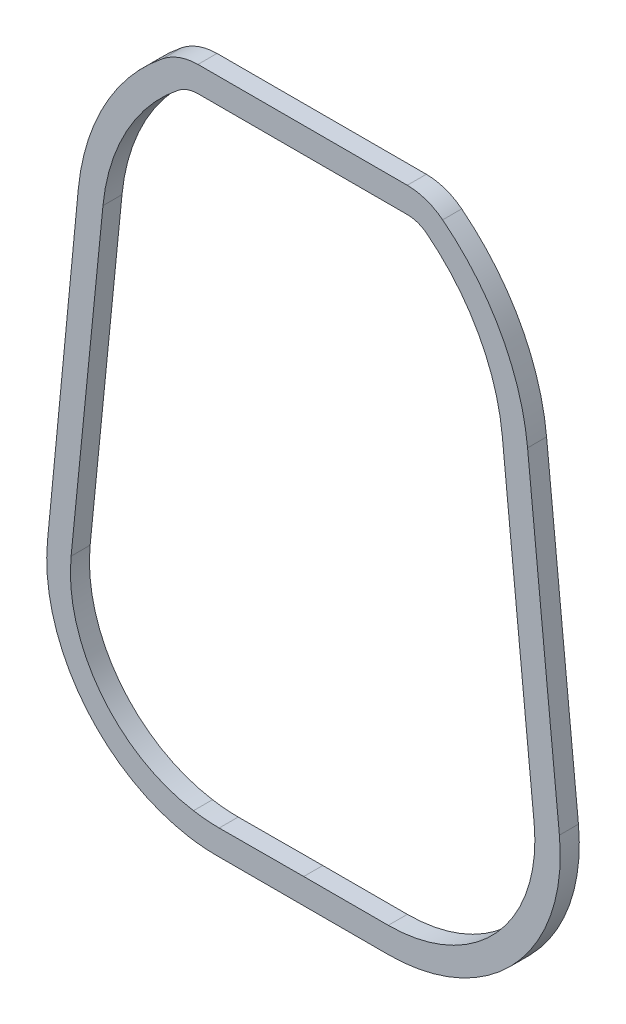
ISO-10303-21;
HEADER;
FILE_DESCRIPTION(('STEP AP214'),'2;1');
FILE_NAME('part.step','',(''),(''),'','','');
FILE_SCHEMA(('AUTOMOTIVE_DESIGN { 1 0 10303 214 1 1 1 1 }'));
ENDSEC;
DATA;
#1=APPLICATION_CONTEXT('core data for automotive mechanical design processes');
#2=APPLICATION_PROTOCOL_DEFINITION('international standard','automotive_design',2000,#1);
#3=PRODUCT_CONTEXT('',#1,'mechanical');
#4=PRODUCT('Part','Part','',(#3));
#5=PRODUCT_RELATED_PRODUCT_CATEGORY('part','',(#4));
#6=PRODUCT_DEFINITION_FORMATION('','',#4);
#7=PRODUCT_DEFINITION_CONTEXT('part definition',#1,'design');
#8=PRODUCT_DEFINITION('design','',#6,#7);
#9=PRODUCT_DEFINITION_SHAPE('','',#8);
#10=(LENGTH_UNIT() NAMED_UNIT(*) SI_UNIT(.MILLI.,.METRE.));
#11=(NAMED_UNIT(*) PLANE_ANGLE_UNIT() SI_UNIT($,.RADIAN.));
#12=(NAMED_UNIT(*) SI_UNIT($,.STERADIAN.) SOLID_ANGLE_UNIT());
#13=UNCERTAINTY_MEASURE_WITH_UNIT(LENGTH_MEASURE(1.E-05),#10,'distance_accuracy_value','');
#14=(GEOMETRIC_REPRESENTATION_CONTEXT(3) GLOBAL_UNCERTAINTY_ASSIGNED_CONTEXT((#13)) GLOBAL_UNIT_ASSIGNED_CONTEXT((#10,
#11,#12)) REPRESENTATION_CONTEXT('',''));
#15=CARTESIAN_POINT('',(0.,0.,0.));
#16=DIRECTION('',(0.,0.,1.));
#17=DIRECTION('',(1.,0.,0.));
#18=AXIS2_PLACEMENT_3D('',#15,#16,#17);
#19=CARTESIAN_POINT('',(0.,0.,1.));
#20=DIRECTION('',(0.,0.,-1.));
#21=DIRECTION('',(-1.,0.,0.));
#22=AXIS2_PLACEMENT_3D('',#19,#20,#21);
#23=PLANE('',#22);
#24=CARTESIAN_POINT('',(1.21430643318376E-13,0.,1.));
#25=DIRECTION('',(0.,0.,-1.));
#26=DIRECTION('',(-1.,0.,0.));
#27=AXIS2_PLACEMENT_3D('',#24,#25,#26);
#28=CIRCLE('',#27,31.6233487372867);
#29=CARTESIAN_POINT('',(19.5895201916886,24.8251260625094,1.));
#30=VERTEX_POINT('',#29);
#31=CARTESIAN_POINT('',(31.4673879650706,3.13682642423676,0.999999999999959));
#32=VERTEX_POINT('',#31);
#33=EDGE_CURVE('E290',#30,#32,#28,.T.);
#34=ORIENTED_EDGE('',*,*,#33,.T.);
#35=DIRECTION('',(-0.0991933665942898,0.995068176570676,0.));
#36=VECTOR('',#35,1.);
#37=CARTESIAN_POINT('',(31.4673879650706,3.13682642423676,0.999999999999945));
#38=LINE('',#37,#36);
#39=CARTESIAN_POINT('',(36.4860748787826,-47.2086332316719,0.999999999999973));
#40=VERTEX_POINT('',#39);
#41=EDGE_CURVE('E208',#32,#40,#38,.F.);
#42=ORIENTED_EDGE('',*,*,#41,.T.);
#43=CARTESIAN_POINT('',(13.4999999999999,-49.4999999999999,1.));
#44=DIRECTION('',(0.,0.,-1.));
#45=DIRECTION('',(-1.,0.,0.));
#46=AXIS2_PLACEMENT_3D('',#43,#44,#45);
#47=CIRCLE('',#46,23.1000000000001);
#48=CARTESIAN_POINT('',(13.4999999999999,-72.6,1.));
#49=VERTEX_POINT('',#48);
#50=EDGE_CURVE('E289',#40,#49,#47,.T.);
#51=ORIENTED_EDGE('',*,*,#50,.T.);
#52=DIRECTION('',(1.,0.,0.));
#53=VECTOR('',#52,1.);
#54=CARTESIAN_POINT('',(0.,-72.6,1.));
#55=LINE('',#54,#53);
#56=CARTESIAN_POINT('',(0.174522376125055,-72.6,0.999999999999936));
#57=VERTEX_POINT('',#56);
#58=EDGE_CURVE('E200',#49,#57,#55,.F.);
#59=ORIENTED_EDGE('',*,*,#58,.T.);
#60=DIRECTION('',(-0.999994201932855,-0.00340530478404836,0.));
#61=VECTOR('',#60,1.);
#62=CARTESIAN_POINT('',(0.247225717673066,-72.5997524215278,0.999999999999945));
#63=LINE('',#62,#61);
#64=CARTESIAN_POINT('',(-13.1508779857284,-72.6453773127023,0.999999999999973));
#65=VERTEX_POINT('',#64);
#66=EDGE_CURVE('E196',#65,#57,#63,.F.);
#67=ORIENTED_EDGE('',*,*,#66,.F.);
#68=CARTESIAN_POINT('',(-13.22954052624,-49.5455112480534,1.));
#69=DIRECTION('',(0.,0.,-1.));
#70=DIRECTION('',(-1.,0.,0.));
#71=AXIS2_PLACEMENT_3D('',#68,#69,#70);
#72=CIRCLE('',#71,23.0999999999999);
#73=CARTESIAN_POINT('',(-17.1979356771359,-72.3020891965575,1.));
#74=VERTEX_POINT('',#73);
#75=EDGE_CURVE('E285',#65,#74,#72,.T.);
#76=ORIENTED_EDGE('',*,*,#75,.T.);
#77=CARTESIAN_POINT('',(-13.4999999999998,-49.4999999999999,1.));
#78=DIRECTION('',(0.,0.,-1.));
#79=DIRECTION('',(-1.,0.,0.));
#80=AXIS2_PLACEMENT_3D('',#77,#78,#79);
#81=CIRCLE('',#80,23.1000000000001);
#82=CARTESIAN_POINT('',(-36.4860748787825,-47.2086332316718,1.));
#83=VERTEX_POINT('',#82);
#84=EDGE_CURVE('E282',#74,#83,#81,.T.);
#85=ORIENTED_EDGE('',*,*,#84,.T.);
#86=DIRECTION('',(-0.0991933665942928,-0.995068176570676,0.));
#87=VECTOR('',#86,1.);
#88=CARTESIAN_POINT('',(-31.4673879650703,3.13682642423683,1.));
#89=LINE('',#88,#87);
#90=CARTESIAN_POINT('',(-31.4673879650703,3.13682642423686,1.));
#91=VERTEX_POINT('',#90);
#92=EDGE_CURVE('E192',#83,#91,#89,.F.);
#93=ORIENTED_EDGE('',*,*,#92,.T.);
#94=CARTESIAN_POINT('',(1.21430643318376E-13,0.,1.));
#95=DIRECTION('',(0.,0.,-1.));
#96=DIRECTION('',(-1.,0.,0.));
#97=AXIS2_PLACEMENT_3D('',#94,#95,#96);
#98=CIRCLE('',#97,31.6233487372867);
#99=CARTESIAN_POINT('',(-19.5895201916883,24.8251260625094,1.));
#100=VERTEX_POINT('',#99);
#101=EDGE_CURVE('E280',#91,#100,#98,.T.);
#102=ORIENTED_EDGE('',*,*,#101,.T.);
#103=CARTESIAN_POINT('',(-16.4922011262045,20.9000000000001,1.));
#104=DIRECTION('',(0.,0.,-1.));
#105=DIRECTION('',(-1.,0.,0.));
#106=AXIS2_PLACEMENT_3D('',#103,#104,#105);
#107=CIRCLE('',#106,4.99999999999996);
#108=CARTESIAN_POINT('',(-16.4922011262045,25.9,1.));
#109=VERTEX_POINT('',#108);
#110=EDGE_CURVE('E184',#100,#109,#107,.T.);
#111=ORIENTED_EDGE('',*,*,#110,.T.);
#112=DIRECTION('',(1.,0.,0.));
#113=VECTOR('',#112,1.);
#114=CARTESIAN_POINT('',(0.,25.9,1.));
#115=LINE('',#114,#113);
#116=CARTESIAN_POINT('',(16.4922011262047,25.9,1.));
#117=VERTEX_POINT('',#116);
#118=EDGE_CURVE('E176',#109,#117,#115,.T.);
#119=ORIENTED_EDGE('',*,*,#118,.T.);
#120=CARTESIAN_POINT('',(16.4922011262047,20.9000000000001,1.));
#121=DIRECTION('',(0.,0.,-1.));
#122=DIRECTION('',(-1.,0.,0.));
#123=AXIS2_PLACEMENT_3D('',#120,#121,#122);
#124=CIRCLE('',#123,4.99999999999998);
#125=EDGE_CURVE('E20',#117,#30,#124,.T.);
#126=ORIENTED_EDGE('',*,*,#125,.T.);
#127=EDGE_LOOP('',(#34,#42,#51,#59,#67,#76,#85,#93,#102,#111,#119,#126));
#128=FACE_BOUND('',#127,.T.);
#129=CARTESIAN_POINT('',(-16.3908627162727,20.9005705443806,1.));
#130=DIRECTION('',(0.,0.,-1.));
#131=DIRECTION('',(-1.,0.,0.));
#132=AXIS2_PLACEMENT_3D('',#129,#130,#131);
#133=CIRCLE('',#132,8.99999999999996);
#134=CARTESIAN_POINT('',(-22.0606590038992,27.8900919912907,1.));
#135=VERTEX_POINT('',#134);
#136=CARTESIAN_POINT('',(-16.4922011262049,29.9000000000001,1.));
#137=VERTEX_POINT('',#136);
#138=EDGE_CURVE('E276',#135,#137,#133,.T.);
#139=ORIENTED_EDGE('',*,*,#138,.F.);
#140=CARTESIAN_POINT('',(0.101818613044768,0.000173362206805361,1.));
#141=DIRECTION('',(0.,0.,-1.));
#142=DIRECTION('',(-1.,0.,0.));
#143=AXIS2_PLACEMENT_3D('',#140,#141,#142);
#144=CIRCLE('',#143,35.6233487372883);
#145=CARTESIAN_POINT('',(-35.3576695150057,3.41304267630436,0.999999999999959));
#146=VERTEX_POINT('',#145);
#147=EDGE_CURVE('E272',#146,#135,#144,.T.);
#148=ORIENTED_EDGE('',*,*,#147,.F.);
#149=DIRECTION('',(0.095804281042363,0.995400190744384,0.));
#150=VECTOR('',#149,1.);
#151=CARTESIAN_POINT('',(-35.358620585544,3.40316111584677,0.999999999999945));
#152=LINE('',#151,#150);
#153=CARTESIAN_POINT('',(-40.2048856954128,-46.9492152318054,0.999999999999973));
#154=VERTEX_POINT('',#153);
#155=EDGE_CURVE('E190',#146,#154,#152,.F.);
#156=ORIENTED_EDGE('',*,*,#155,.T.);
#157=CARTESIAN_POINT('',(-13.22954052624,-49.5455112480534,1.));
#158=DIRECTION('',(0.,0.,-1.));
#159=DIRECTION('',(-1.,0.,0.));
#160=AXIS2_PLACEMENT_3D('',#157,#158,#159);
#161=CIRCLE('',#160,27.1);
#162=CARTESIAN_POINT('',(-17.8617089296231,-76.2466912946862,1.));
#163=VERTEX_POINT('',#162);
#164=EDGE_CURVE('E269',#163,#154,#161,.T.);
#165=ORIENTED_EDGE('',*,*,#164,.F.);
#166=CARTESIAN_POINT('',(-13.4999999999998,-49.4999999999999,1.));
#167=DIRECTION('',(0.,0.,-1.));
#168=DIRECTION('',(-1.,0.,0.));
#169=AXIS2_PLACEMENT_3D('',#166,#167,#168);
#170=CIRCLE('',#169,27.1000000000001);
#171=CARTESIAN_POINT('',(-13.4999999999999,-76.6,1.));
#172=VERTEX_POINT('',#171);
#173=EDGE_CURVE('E266',#172,#163,#170,.T.);
#174=ORIENTED_EDGE('',*,*,#173,.F.);
#175=DIRECTION('',(-1.,0.,0.));
#176=VECTOR('',#175,1.);
#177=CARTESIAN_POINT('',(0.,-76.6,1.));
#178=LINE('',#177,#176);
#179=CARTESIAN_POINT('',(13.5,-76.6000000000001,1.));
#180=VERTEX_POINT('',#179);
#181=EDGE_CURVE('E265',#172,#180,#178,.F.);
#182=ORIENTED_EDGE('',*,*,#181,.T.);
#183=CARTESIAN_POINT('',(13.4999999999999,-49.4999999999999,1.));
#184=DIRECTION('',(0.,0.,-1.));
#185=DIRECTION('',(-1.,0.,0.));
#186=AXIS2_PLACEMENT_3D('',#183,#184,#185);
#187=CIRCLE('',#186,27.1000000000002);
#188=CARTESIAN_POINT('',(40.4663475850655,-46.8118597652947,0.999999999999959));
#189=VERTEX_POINT('',#188);
#190=EDGE_CURVE('E262',#189,#180,#187,.T.);
#191=ORIENTED_EDGE('',*,*,#190,.F.);
#192=DIRECTION('',(0.0991933665942933,-0.995068176570676,0.));
#193=VECTOR('',#192,1.);
#194=CARTESIAN_POINT('',(35.4476606713533,3.53359989061405,0.999999999999945));
#195=LINE('',#194,#193);
#196=CARTESIAN_POINT('',(35.4476606713533,3.53359989061398,0.999999999999973));
#197=VERTEX_POINT('',#196);
#198=EDGE_CURVE('E261',#189,#197,#195,.F.);
#199=ORIENTED_EDGE('',*,*,#198,.T.);
#200=CARTESIAN_POINT('',(1.21430643318376E-13,0.,1.));
#201=DIRECTION('',(0.,0.,-1.));
#202=DIRECTION('',(-1.,0.,0.));
#203=AXIS2_PLACEMENT_3D('',#200,#201,#202);
#204=CIRCLE('',#203,35.6233487372867);
#205=CARTESIAN_POINT('',(22.0673754440757,27.9652269125169,1.));
#206=VERTEX_POINT('',#205);
#207=EDGE_CURVE('E258',#206,#197,#204,.T.);
#208=ORIENTED_EDGE('',*,*,#207,.F.);
#209=CARTESIAN_POINT('',(16.4922011262047,20.9000000000001,1.));
#210=DIRECTION('',(0.,0.,-1.));
#211=DIRECTION('',(-1.,0.,0.));
#212=AXIS2_PLACEMENT_3D('',#209,#210,#211);
#213=CIRCLE('',#212,8.99999999999998);
#214=CARTESIAN_POINT('',(16.4922011262047,29.9,1.));
#215=VERTEX_POINT('',#214);
#216=EDGE_CURVE('E255',#215,#206,#213,.T.);
#217=ORIENTED_EDGE('',*,*,#216,.F.);
#218=DIRECTION('',(1.,0.,0.));
#219=VECTOR('',#218,1.);
#220=CARTESIAN_POINT('',(0.,29.9,1.));
#221=LINE('',#220,#219);
#222=EDGE_CURVE('E180',#215,#137,#221,.F.);
#223=ORIENTED_EDGE('',*,*,#222,.T.);
#224=EDGE_LOOP('',(#139,#148,#156,#165,#174,#182,#191,#199,#208,#217,#223));
#225=FACE_BOUND('',#224,.T.);
#226=ADVANCED_FACE('F17',(#128,#225),#23,.F.);
#227=CARTESIAN_POINT('',(16.4922011262047,20.9000000000001,135.760384754936));
#228=DIRECTION('',(0.,0.,-1.));
#229=DIRECTION('',(-1.,0.,0.));
#230=AXIS2_PLACEMENT_3D('',#227,#228,#229);
#231=CYLINDRICAL_SURFACE('',#230,4.99999999999998);
#232=ORIENTED_EDGE('',*,*,#125,.F.);
#233=DIRECTION('',(0.,0.,1.));
#234=VECTOR('',#233,1.);
#235=CARTESIAN_POINT('',(16.4922011262048,25.9,135.760384754936));
#236=LINE('',#235,#234);
#237=CARTESIAN_POINT('',(16.4922011262047,25.9,-2.));
#238=VERTEX_POINT('',#237);
#239=EDGE_CURVE('E167',#117,#238,#236,.F.);
#240=ORIENTED_EDGE('',*,*,#239,.T.);
#241=CARTESIAN_POINT('',(16.4922011262047,20.9000000000001,-2.));
#242=DIRECTION('',(0.,0.,-1.));
#243=DIRECTION('',(-1.,0.,0.));
#244=AXIS2_PLACEMENT_3D('',#241,#242,#243);
#245=CIRCLE('',#244,4.99999999999998);
#246=CARTESIAN_POINT('',(19.5895201916886,24.8251260625094,-2.));
#247=VERTEX_POINT('',#246);
#248=EDGE_CURVE('E253',#238,#247,#245,.T.);
#249=ORIENTED_EDGE('',*,*,#248,.T.);
#250=DIRECTION('',(0.,0.,-1.));
#251=VECTOR('',#250,1.);
#252=CARTESIAN_POINT('',(19.5895201916886,24.8251260625094,135.760384754936));
#253=LINE('',#252,#251);
#254=EDGE_CURVE('E169',#247,#30,#253,.F.);
#255=ORIENTED_EDGE('',*,*,#254,.T.);
#256=EDGE_LOOP('',(#232,#240,#249,#255));
#257=FACE_BOUND('',#256,.T.);
#258=ADVANCED_FACE('F165',(#257),#231,.F.);
#259=CARTESIAN_POINT('',(1.21430643318376E-13,0.,135.760384754936));
#260=DIRECTION('',(0.,0.,-1.));
#261=DIRECTION('',(-1.,0.,0.));
#262=AXIS2_PLACEMENT_3D('',#259,#260,#261);
#263=CYLINDRICAL_SURFACE('',#262,31.6233487372867);
#264=ORIENTED_EDGE('',*,*,#33,.F.);
#265=ORIENTED_EDGE('',*,*,#254,.F.);
#266=CARTESIAN_POINT('',(1.21430643318376E-13,0.,-2.));
#267=DIRECTION('',(0.,0.,-1.));
#268=DIRECTION('',(-1.,0.,0.));
#269=AXIS2_PLACEMENT_3D('',#266,#267,#268);
#270=CIRCLE('',#269,31.6233487372867);
#271=CARTESIAN_POINT('',(31.4673879650706,3.13682642423676,-2.00000000000001));
#272=VERTEX_POINT('',#271);
#273=EDGE_CURVE('E250',#247,#272,#270,.T.);
#274=ORIENTED_EDGE('',*,*,#273,.T.);
#275=DIRECTION('',(0.,0.,1.));
#276=VECTOR('',#275,1.);
#277=CARTESIAN_POINT('',(31.4673879650706,3.13682642423676,135.760384754936));
#278=LINE('',#277,#276);
#279=EDGE_CURVE('E210',#272,#32,#278,.T.);
#280=ORIENTED_EDGE('',*,*,#279,.T.);
#281=EDGE_LOOP('',(#264,#265,#274,#280));
#282=FACE_BOUND('',#281,.T.);
#283=ADVANCED_FACE('F400',(#282),#263,.F.);
#284=CARTESIAN_POINT('',(31.4673879650706,3.13682642423676,135.760384754936));
#285=DIRECTION('',(0.995068176570676,0.0991933665942898,0.));
#286=DIRECTION('',(-0.0991933665942898,0.995068176570676,0.));
#287=AXIS2_PLACEMENT_3D('',#284,#285,#286);
#288=PLANE('',#287);
#289=ORIENTED_EDGE('',*,*,#41,.F.);
#290=ORIENTED_EDGE('',*,*,#279,.F.);
#291=DIRECTION('',(0.0991933665942897,-0.995068176570676,0.));
#292=VECTOR('',#291,1.);
#293=CARTESIAN_POINT('',(31.4673879650706,3.13682642423676,-2.));
#294=LINE('',#293,#292);
#295=CARTESIAN_POINT('',(36.4860748787826,-47.2086332316719,-2.00000000000001));
#296=VERTEX_POINT('',#295);
#297=EDGE_CURVE('E249',#272,#296,#294,.T.);
#298=ORIENTED_EDGE('',*,*,#297,.T.);
#299=DIRECTION('',(0.,0.,-1.));
#300=VECTOR('',#299,1.);
#301=CARTESIAN_POINT('',(36.4860748787826,-47.2086332316719,135.760384754936));
#302=LINE('',#301,#300);
#303=EDGE_CURVE('E209',#296,#40,#302,.F.);
#304=ORIENTED_EDGE('',*,*,#303,.T.);
#305=EDGE_LOOP('',(#289,#290,#298,#304));
#306=FACE_BOUND('',#305,.T.);
#307=ADVANCED_FACE('F337',(#306),#288,.F.);
#308=CARTESIAN_POINT('',(13.4999999999999,-49.4999999999999,135.760384754936));
#309=DIRECTION('',(0.,0.,-1.));
#310=DIRECTION('',(-1.,0.,0.));
#311=AXIS2_PLACEMENT_3D('',#308,#309,#310);
#312=CYLINDRICAL_SURFACE('',#311,23.1000000000001);
#313=ORIENTED_EDGE('',*,*,#50,.F.);
#314=ORIENTED_EDGE('',*,*,#303,.F.);
#315=CARTESIAN_POINT('',(13.4999999999999,-49.4999999999999,-2.));
#316=DIRECTION('',(0.,0.,-1.));
#317=DIRECTION('',(-1.,0.,0.));
#318=AXIS2_PLACEMENT_3D('',#315,#316,#317);
#319=CIRCLE('',#318,23.1000000000001);
#320=CARTESIAN_POINT('',(13.5,-72.6,-2.));
#321=VERTEX_POINT('',#320);
#322=EDGE_CURVE('E245',#296,#321,#319,.T.);
#323=ORIENTED_EDGE('',*,*,#322,.T.);
#324=DIRECTION('',(0.,0.,1.));
#325=VECTOR('',#324,1.);
#326=CARTESIAN_POINT('',(13.5,-72.6,135.760384754936));
#327=LINE('',#326,#325);
#328=EDGE_CURVE('E205',#321,#49,#327,.T.);
#329=ORIENTED_EDGE('',*,*,#328,.T.);
#330=EDGE_LOOP('',(#313,#314,#323,#329));
#331=FACE_BOUND('',#330,.T.);
#332=ADVANCED_FACE('F342',(#331),#312,.F.);
#333=CARTESIAN_POINT('',(0.,-72.6,135.760384754936));
#334=DIRECTION('',(0.,-1.,0.));
#335=DIRECTION('',(1.,0.,0.));
#336=AXIS2_PLACEMENT_3D('',#333,#334,#335);
#337=PLANE('',#336);
#338=ORIENTED_EDGE('',*,*,#58,.F.);
#339=ORIENTED_EDGE('',*,*,#328,.F.);
#340=DIRECTION('',(1.,0.,0.));
#341=VECTOR('',#340,1.);
#342=CARTESIAN_POINT('',(0.,-72.6,-2.));
#343=LINE('',#342,#341);
#344=CARTESIAN_POINT('',(0.174522376126758,-72.6,-2.00000000000002));
#345=VERTEX_POINT('',#344);
#346=EDGE_CURVE('E248',#321,#345,#343,.F.);
#347=ORIENTED_EDGE('',*,*,#346,.T.);
#348=DIRECTION('',(0.,0.,1.));
#349=VECTOR('',#348,1.);
#350=CARTESIAN_POINT('',(0.174522376125055,-72.6,135.760384754936));
#351=LINE('',#350,#349);
#352=EDGE_CURVE('E199',#57,#345,#351,.F.);
#353=ORIENTED_EDGE('',*,*,#352,.F.);
#354=EDGE_LOOP('',(#338,#339,#347,#353));
#355=FACE_BOUND('',#354,.T.);
#356=ADVANCED_FACE('F471',(#355),#337,.F.);
#357=CARTESIAN_POINT('',(0.247225717673066,-72.5997524215278,135.760384754936));
#358=DIRECTION('',(-0.00340530478404836,0.999994201932855,0.));
#359=DIRECTION('',(-0.999994201932855,-0.00340530478404836,0.));
#360=AXIS2_PLACEMENT_3D('',#357,#358,#359);
#361=PLANE('',#360);
#362=DIRECTION('',(-0.999994201932855,-0.00340530478404799,0.));
#363=VECTOR('',#362,1.);
#364=CARTESIAN_POINT('',(0.174522376125055,-72.6,-2.));
#365=LINE('',#364,#363);
#366=CARTESIAN_POINT('',(-13.1508779857284,-72.6453773127023,-2.00000000000002));
#367=VERTEX_POINT('',#366);
#368=EDGE_CURVE('E244',#345,#367,#365,.T.);
#369=ORIENTED_EDGE('',*,*,#368,.T.);
#370=DIRECTION('',(0.,0.,-1.));
#371=VECTOR('',#370,1.);
#372=CARTESIAN_POINT('',(-13.1508779857283,-72.6453773127023,135.760384754936));
#373=LINE('',#372,#371);
#374=EDGE_CURVE('E288',#367,#65,#373,.F.);
#375=ORIENTED_EDGE('',*,*,#374,.T.);
#376=ORIENTED_EDGE('',*,*,#66,.T.);
#377=ORIENTED_EDGE('',*,*,#352,.T.);
#378=EDGE_LOOP('',(#369,#375,#376,#377));
#379=FACE_BOUND('',#378,.T.);
#380=ADVANCED_FACE('F467',(#379),#361,.T.);
#381=CARTESIAN_POINT('',(-13.22954052624,-49.5455112480534,135.760384754936));
#382=DIRECTION('',(0.,0.,-1.));
#383=DIRECTION('',(-1.,0.,0.));
#384=AXIS2_PLACEMENT_3D('',#381,#382,#383);
#385=CYLINDRICAL_SURFACE('',#384,23.0999999999999);
#386=ORIENTED_EDGE('',*,*,#374,.F.);
#387=CARTESIAN_POINT('',(-13.22954052624,-49.5455112480534,-2.));
#388=DIRECTION('',(0.,0.,-1.));
#389=DIRECTION('',(-1.,0.,0.));
#390=AXIS2_PLACEMENT_3D('',#387,#388,#389);
#391=CIRCLE('',#390,23.0999999999999);
#392=CARTESIAN_POINT('',(-17.1979356771359,-72.3020891965575,-2.));
#393=VERTEX_POINT('',#392);
#394=EDGE_CURVE('E241',#367,#393,#391,.T.);
#395=ORIENTED_EDGE('',*,*,#394,.T.);
#396=DIRECTION('',(0.,0.,-1.));
#397=VECTOR('',#396,1.);
#398=CARTESIAN_POINT('',(-17.197935677136,-72.3020891965574,135.760384754936));
#399=LINE('',#398,#397);
#400=EDGE_CURVE('E284',#393,#74,#399,.F.);
#401=ORIENTED_EDGE('',*,*,#400,.T.);
#402=ORIENTED_EDGE('',*,*,#75,.F.);
#403=EDGE_LOOP('',(#386,#395,#401,#402));
#404=FACE_BOUND('',#403,.T.);
#405=ADVANCED_FACE('F463',(#404),#385,.F.);
#406=CARTESIAN_POINT('',(-13.4999999999998,-49.4999999999999,135.760384754936));
#407=DIRECTION('',(0.,0.,-1.));
#408=DIRECTION('',(-1.,0.,0.));
#409=AXIS2_PLACEMENT_3D('',#406,#407,#408);
#410=CYLINDRICAL_SURFACE('',#409,23.1000000000001);
#411=ORIENTED_EDGE('',*,*,#84,.F.);
#412=ORIENTED_EDGE('',*,*,#400,.F.);
#413=CARTESIAN_POINT('',(-13.4999999999998,-49.4999999999999,-2.));
#414=DIRECTION('',(0.,0.,-1.));
#415=DIRECTION('',(-1.,0.,0.));
#416=AXIS2_PLACEMENT_3D('',#413,#414,#415);
#417=CIRCLE('',#416,23.1000000000001);
#418=CARTESIAN_POINT('',(-36.4860748787825,-47.2086332316718,-2.));
#419=VERTEX_POINT('',#418);
#420=EDGE_CURVE('E239',#393,#419,#417,.T.);
#421=ORIENTED_EDGE('',*,*,#420,.T.);
#422=DIRECTION('',(0.,0.,1.));
#423=VECTOR('',#422,1.);
#424=CARTESIAN_POINT('',(-36.4860748787825,-47.2086332316718,135.760384754936));
#425=LINE('',#424,#423);
#426=EDGE_CURVE('E195',#419,#83,#425,.T.);
#427=ORIENTED_EDGE('',*,*,#426,.T.);
#428=EDGE_LOOP('',(#411,#412,#421,#427));
#429=FACE_BOUND('',#428,.T.);
#430=ADVANCED_FACE('F460',(#429),#410,.F.);
#431=CARTESIAN_POINT('',(-31.4673879650703,3.13682642423683,135.760384754936));
#432=DIRECTION('',(-0.995068176570676,0.0991933665942928,0.));
#433=DIRECTION('',(-0.0991933665942928,-0.995068176570676,0.));
#434=AXIS2_PLACEMENT_3D('',#431,#432,#433);
#435=PLANE('',#434);
#436=ORIENTED_EDGE('',*,*,#92,.F.);
#437=ORIENTED_EDGE('',*,*,#426,.F.);
#438=DIRECTION('',(0.0991933665942929,0.995068176570676,0.));
#439=VECTOR('',#438,1.);
#440=CARTESIAN_POINT('',(-36.4860748787825,-47.2086332316718,-2.));
#441=LINE('',#440,#439);
#442=CARTESIAN_POINT('',(-31.4673879650703,3.13682642423687,-2.));
#443=VERTEX_POINT('',#442);
#444=EDGE_CURVE('E238',#419,#443,#441,.T.);
#445=ORIENTED_EDGE('',*,*,#444,.T.);
#446=DIRECTION('',(0.,0.,-1.));
#447=VECTOR('',#446,1.);
#448=CARTESIAN_POINT('',(-31.4673879650703,3.13682642423687,135.760384754936));
#449=LINE('',#448,#447);
#450=EDGE_CURVE('E194',#443,#91,#449,.F.);
#451=ORIENTED_EDGE('',*,*,#450,.T.);
#452=EDGE_LOOP('',(#436,#437,#445,#451));
#453=FACE_BOUND('',#452,.T.);
#454=ADVANCED_FACE('F391',(#453),#435,.F.);
#455=CARTESIAN_POINT('',(1.21430643318376E-13,0.,135.760384754936));
#456=DIRECTION('',(0.,0.,-1.));
#457=DIRECTION('',(-1.,0.,0.));
#458=AXIS2_PLACEMENT_3D('',#455,#456,#457);
#459=CYLINDRICAL_SURFACE('',#458,31.6233487372867);
#460=ORIENTED_EDGE('',*,*,#101,.F.);
#461=ORIENTED_EDGE('',*,*,#450,.F.);
#462=CARTESIAN_POINT('',(1.21430643318376E-13,0.,-2.));
#463=DIRECTION('',(0.,0.,-1.));
#464=DIRECTION('',(-1.,0.,0.));
#465=AXIS2_PLACEMENT_3D('',#462,#463,#464);
#466=CIRCLE('',#465,31.6233487372867);
#467=CARTESIAN_POINT('',(-19.5895201916883,24.8251260625094,-2.));
#468=VERTEX_POINT('',#467);
#469=EDGE_CURVE('E235',#443,#468,#466,.T.);
#470=ORIENTED_EDGE('',*,*,#469,.T.);
#471=DIRECTION('',(0.,0.,-1.));
#472=VECTOR('',#471,1.);
#473=CARTESIAN_POINT('',(-19.5895201916883,24.8251260625094,135.760384754936));
#474=LINE('',#473,#472);
#475=EDGE_CURVE('E279',#468,#100,#474,.F.);
#476=ORIENTED_EDGE('',*,*,#475,.T.);
#477=EDGE_LOOP('',(#460,#461,#470,#476));
#478=FACE_BOUND('',#477,.T.);
#479=ADVANCED_FACE('F396',(#478),#459,.F.);
#480=CARTESIAN_POINT('',(-16.4922011262045,20.9000000000001,135.760384754936));
#481=DIRECTION('',(0.,0.,-1.));
#482=DIRECTION('',(-1.,0.,0.));
#483=AXIS2_PLACEMENT_3D('',#480,#481,#482);
#484=CYLINDRICAL_SURFACE('',#483,4.99999999999996);
#485=ORIENTED_EDGE('',*,*,#110,.F.);
#486=ORIENTED_EDGE('',*,*,#475,.F.);
#487=CARTESIAN_POINT('',(-16.4922011262045,20.9000000000001,-2.));
#488=DIRECTION('',(0.,0.,-1.));
#489=DIRECTION('',(-1.,0.,0.));
#490=AXIS2_PLACEMENT_3D('',#487,#488,#489);
#491=CIRCLE('',#490,4.99999999999996);
#492=CARTESIAN_POINT('',(-16.4922011262045,25.9,-2.));
#493=VERTEX_POINT('',#492);
#494=EDGE_CURVE('E232',#468,#493,#491,.T.);
#495=ORIENTED_EDGE('',*,*,#494,.T.);
#496=DIRECTION('',(0.,0.,1.));
#497=VECTOR('',#496,1.);
#498=CARTESIAN_POINT('',(-16.4922011262045,25.9,135.760384754936));
#499=LINE('',#498,#497);
#500=EDGE_CURVE('E185',#493,#109,#499,.T.);
#501=ORIENTED_EDGE('',*,*,#500,.T.);
#502=EDGE_LOOP('',(#485,#486,#495,#501));
#503=FACE_BOUND('',#502,.T.);
#504=ADVANCED_FACE('F398',(#503),#484,.F.);
#505=CARTESIAN_POINT('',(0.,25.9,135.760384754936));
#506=DIRECTION('',(0.,1.,0.));
#507=DIRECTION('',(0.,0.,1.));
#508=AXIS2_PLACEMENT_3D('',#505,#506,#507);
#509=PLANE('',#508);
#510=ORIENTED_EDGE('',*,*,#118,.F.);
#511=ORIENTED_EDGE('',*,*,#500,.F.);
#512=DIRECTION('',(1.,0.,0.));
#513=VECTOR('',#512,1.);
#514=CARTESIAN_POINT('',(0.,25.9,-2.));
#515=LINE('',#514,#513);
#516=EDGE_CURVE('E179',#493,#238,#515,.T.);
#517=ORIENTED_EDGE('',*,*,#516,.T.);
#518=ORIENTED_EDGE('',*,*,#239,.F.);
#519=EDGE_LOOP('',(#510,#511,#517,#518));
#520=FACE_BOUND('',#519,.T.);
#521=ADVANCED_FACE('F175',(#520),#509,.F.);
#522=CARTESIAN_POINT('',(0.,29.9,135.760384754936));
#523=DIRECTION('',(0.,-1.,0.));
#524=DIRECTION('',(0.,0.,-1.));
#525=AXIS2_PLACEMENT_3D('',#522,#523,#524);
#526=PLANE('',#525);
#527=ORIENTED_EDGE('',*,*,#222,.F.);
#528=DIRECTION('',(0.,0.,-1.));
#529=VECTOR('',#528,1.);
#530=CARTESIAN_POINT('',(16.4922011262048,29.9,135.760384754936));
#531=LINE('',#530,#529);
#532=CARTESIAN_POINT('',(16.4922011262047,29.9,-2.));
#533=VERTEX_POINT('',#532);
#534=EDGE_CURVE('E257',#533,#215,#531,.F.);
#535=ORIENTED_EDGE('',*,*,#534,.F.);
#536=DIRECTION('',(1.,0.,0.));
#537=VECTOR('',#536,1.);
#538=CARTESIAN_POINT('',(0.,29.9,-2.));
#539=LINE('',#538,#537);
#540=CARTESIAN_POINT('',(-16.4922011262049,29.9000000000001,-2.));
#541=VERTEX_POINT('',#540);
#542=EDGE_CURVE('E231',#533,#541,#539,.F.);
#543=ORIENTED_EDGE('',*,*,#542,.T.);
#544=DIRECTION('',(0.,0.,-1.));
#545=VECTOR('',#544,1.);
#546=CARTESIAN_POINT('',(-16.4922011262044,29.9000000000001,135.760384754936));
#547=LINE('',#546,#545);
#548=EDGE_CURVE('E275',#137,#541,#547,.T.);
#549=ORIENTED_EDGE('',*,*,#548,.F.);
#550=EDGE_LOOP('',(#527,#535,#543,#549));
#551=FACE_BOUND('',#550,.T.);
#552=ADVANCED_FACE('F447',(#551),#526,.F.);
#553=CARTESIAN_POINT('',(-16.3908627162727,20.9005705443806,135.760384754936));
#554=DIRECTION('',(0.,0.,-1.));
#555=DIRECTION('',(-1.,0.,0.));
#556=AXIS2_PLACEMENT_3D('',#553,#554,#555);
#557=CYLINDRICAL_SURFACE('',#556,8.99999999999996);
#558=CARTESIAN_POINT('',(-16.3908627162727,20.9005705443806,-2.));
#559=DIRECTION('',(0.,0.,-1.));
#560=DIRECTION('',(-1.,0.,0.));
#561=AXIS2_PLACEMENT_3D('',#558,#559,#560);
#562=CIRCLE('',#561,8.99999999999996);
#563=CARTESIAN_POINT('',(-22.0606590038992,27.8900919912907,-2.));
#564=VERTEX_POINT('',#563);
#565=EDGE_CURVE('E228',#541,#564,#562,.F.);
#566=ORIENTED_EDGE('',*,*,#565,.T.);
#567=DIRECTION('',(0.,0.,-1.));
#568=VECTOR('',#567,1.);
#569=CARTESIAN_POINT('',(-22.0606590039,27.89009199129,135.760384754936));
#570=LINE('',#569,#568);
#571=EDGE_CURVE('E274',#135,#564,#570,.T.);
#572=ORIENTED_EDGE('',*,*,#571,.F.);
#573=ORIENTED_EDGE('',*,*,#138,.T.);
#574=ORIENTED_EDGE('',*,*,#548,.T.);
#575=EDGE_LOOP('',(#566,#572,#573,#574));
#576=FACE_BOUND('',#575,.T.);
#577=ADVANCED_FACE('F443',(#576),#557,.T.);
#578=CARTESIAN_POINT('',(0.101818613044768,0.000173362206805361,135.760384754936));
#579=DIRECTION('',(0.,0.,-1.));
#580=DIRECTION('',(-1.,0.,0.));
#581=AXIS2_PLACEMENT_3D('',#578,#579,#580);
#582=CYLINDRICAL_SURFACE('',#581,35.6233487372883);
#583=ORIENTED_EDGE('',*,*,#571,.T.);
#584=CARTESIAN_POINT('',(0.101818613044768,0.000173362206805361,-2.));
#585=DIRECTION('',(0.,0.,-1.));
#586=DIRECTION('',(-1.,0.,0.));
#587=AXIS2_PLACEMENT_3D('',#584,#585,#586);
#588=CIRCLE('',#587,35.6233487372883);
#589=CARTESIAN_POINT('',(-35.3576695150057,3.41304267630436,-2.));
#590=VERTEX_POINT('',#589);
#591=EDGE_CURVE('E225',#564,#590,#588,.F.);
#592=ORIENTED_EDGE('',*,*,#591,.T.);
#593=DIRECTION('',(0.,0.,1.));
#594=VECTOR('',#593,1.);
#595=CARTESIAN_POINT('',(-35.3576695150057,3.41304267630463,135.760384754936));
#596=LINE('',#595,#594);
#597=EDGE_CURVE('E314',#590,#146,#596,.T.);
#598=ORIENTED_EDGE('',*,*,#597,.T.);
#599=ORIENTED_EDGE('',*,*,#147,.T.);
#600=EDGE_LOOP('',(#583,#592,#598,#599));
#601=FACE_BOUND('',#600,.T.);
#602=ADVANCED_FACE('F439',(#601),#582,.T.);
#603=CARTESIAN_POINT('',(-35.358620585544,3.40316111584677,135.760384754936));
#604=DIRECTION('',(0.995400190744384,-0.095804281042363,0.));
#605=DIRECTION('',(0.095804281042363,0.995400190744384,0.));
#606=AXIS2_PLACEMENT_3D('',#603,#604,#605);
#607=PLANE('',#606);
#608=ORIENTED_EDGE('',*,*,#155,.F.);
#609=ORIENTED_EDGE('',*,*,#597,.F.);
#610=DIRECTION('',(-0.095804281042363,-0.995400190744384,0.));
#611=VECTOR('',#610,1.);
#612=CARTESIAN_POINT('',(-35.3576695150057,3.41304267630463,-2.));
#613=LINE('',#612,#611);
#614=CARTESIAN_POINT('',(-40.2048856954128,-46.9492152318054,-2.00000000000001));
#615=VERTEX_POINT('',#614);
#616=EDGE_CURVE('E224',#590,#615,#613,.T.);
#617=ORIENTED_EDGE('',*,*,#616,.T.);
#618=DIRECTION('',(0.,0.,-1.));
#619=VECTOR('',#618,1.);
#620=CARTESIAN_POINT('',(-40.2048856954128,-46.9492152318054,135.760384754936));
#621=LINE('',#620,#619);
#622=EDGE_CURVE('E271',#154,#615,#621,.T.);
#623=ORIENTED_EDGE('',*,*,#622,.F.);
#624=EDGE_LOOP('',(#608,#609,#617,#623));
#625=FACE_BOUND('',#624,.T.);
#626=ADVANCED_FACE('F435',(#625),#607,.F.);
#627=CARTESIAN_POINT('',(-13.22954052624,-49.5455112480534,135.760384754936));
#628=DIRECTION('',(0.,0.,-1.));
#629=DIRECTION('',(-1.,0.,0.));
#630=AXIS2_PLACEMENT_3D('',#627,#628,#629);
#631=CYLINDRICAL_SURFACE('',#630,27.1);
#632=CARTESIAN_POINT('',(-13.22954052624,-49.5455112480534,-2.));
#633=DIRECTION('',(0.,0.,-1.));
#634=DIRECTION('',(-1.,0.,0.));
#635=AXIS2_PLACEMENT_3D('',#632,#633,#634);
#636=CIRCLE('',#635,27.1);
#637=CARTESIAN_POINT('',(-17.8617089296231,-76.2466912946862,-2.));
#638=VERTEX_POINT('',#637);
#639=EDGE_CURVE('E222',#615,#638,#636,.F.);
#640=ORIENTED_EDGE('',*,*,#639,.T.);
#641=DIRECTION('',(0.,0.,-1.));
#642=VECTOR('',#641,1.);
#643=CARTESIAN_POINT('',(-17.8617089296231,-76.2466912946862,135.760384754936));
#644=LINE('',#643,#642);
#645=EDGE_CURVE('E268',#163,#638,#644,.T.);
#646=ORIENTED_EDGE('',*,*,#645,.F.);
#647=ORIENTED_EDGE('',*,*,#164,.T.);
#648=ORIENTED_EDGE('',*,*,#622,.T.);
#649=EDGE_LOOP('',(#640,#646,#647,#648));
#650=FACE_BOUND('',#649,.T.);
#651=ADVANCED_FACE('F432',(#650),#631,.T.);
#652=CARTESIAN_POINT('',(-13.4999999999998,-49.4999999999999,135.760384754936));
#653=DIRECTION('',(0.,0.,-1.));
#654=DIRECTION('',(-1.,0.,0.));
#655=AXIS2_PLACEMENT_3D('',#652,#653,#654);
#656=CYLINDRICAL_SURFACE('',#655,27.1000000000001);
#657=ORIENTED_EDGE('',*,*,#645,.T.);
#658=CARTESIAN_POINT('',(-13.4999999999998,-49.4999999999999,-2.));
#659=DIRECTION('',(0.,0.,-1.));
#660=DIRECTION('',(-1.,0.,0.));
#661=AXIS2_PLACEMENT_3D('',#658,#659,#660);
#662=CIRCLE('',#661,27.1000000000001);
#663=CARTESIAN_POINT('',(-13.4999999999999,-76.6,-2.));
#664=VERTEX_POINT('',#663);
#665=EDGE_CURVE('E219',#638,#664,#662,.F.);
#666=ORIENTED_EDGE('',*,*,#665,.T.);
#667=DIRECTION('',(0.,0.,1.));
#668=VECTOR('',#667,1.);
#669=CARTESIAN_POINT('',(-13.5,-76.6,135.760384754936));
#670=LINE('',#669,#668);
#671=EDGE_CURVE('E302',#664,#172,#670,.T.);
#672=ORIENTED_EDGE('',*,*,#671,.T.);
#673=ORIENTED_EDGE('',*,*,#173,.T.);
#674=EDGE_LOOP('',(#657,#666,#672,#673));
#675=FACE_BOUND('',#674,.T.);
#676=ADVANCED_FACE('F429',(#675),#656,.T.);
#677=CARTESIAN_POINT('',(0.,-76.6,135.760384754936));
#678=DIRECTION('',(0.,1.,0.));
#679=DIRECTION('',(-1.,0.,0.));
#680=AXIS2_PLACEMENT_3D('',#677,#678,#679);
#681=PLANE('',#680);
#682=ORIENTED_EDGE('',*,*,#181,.F.);
#683=ORIENTED_EDGE('',*,*,#671,.F.);
#684=DIRECTION('',(1.,0.,0.));
#685=VECTOR('',#684,1.);
#686=CARTESIAN_POINT('',(0.,-76.6,-2.));
#687=LINE('',#686,#685);
#688=CARTESIAN_POINT('',(13.5,-76.6,-2.));
#689=VERTEX_POINT('',#688);
#690=EDGE_CURVE('E218',#664,#689,#687,.T.);
#691=ORIENTED_EDGE('',*,*,#690,.T.);
#692=DIRECTION('',(0.,0.,-1.));
#693=VECTOR('',#692,1.);
#694=CARTESIAN_POINT('',(13.5,-76.6000000000001,135.760384754936));
#695=LINE('',#694,#693);
#696=EDGE_CURVE('E264',#180,#689,#695,.T.);
#697=ORIENTED_EDGE('',*,*,#696,.F.);
#698=EDGE_LOOP('',(#682,#683,#691,#697));
#699=FACE_BOUND('',#698,.T.);
#700=ADVANCED_FACE('F377',(#699),#681,.F.);
#701=CARTESIAN_POINT('',(13.4999999999999,-49.4999999999999,135.760384754936));
#702=DIRECTION('',(0.,0.,-1.));
#703=DIRECTION('',(-1.,0.,0.));
#704=AXIS2_PLACEMENT_3D('',#701,#702,#703);
#705=CYLINDRICAL_SURFACE('',#704,27.1000000000002);
#706=ORIENTED_EDGE('',*,*,#696,.T.);
#707=CARTESIAN_POINT('',(13.4999999999999,-49.4999999999999,-2.));
#708=DIRECTION('',(0.,0.,-1.));
#709=DIRECTION('',(-1.,0.,0.));
#710=AXIS2_PLACEMENT_3D('',#707,#708,#709);
#711=CIRCLE('',#710,27.1000000000002);
#712=CARTESIAN_POINT('',(40.4663475850655,-46.8118597652947,-1.99999999999999));
#713=VERTEX_POINT('',#712);
#714=EDGE_CURVE('E215',#689,#713,#711,.F.);
#715=ORIENTED_EDGE('',*,*,#714,.T.);
#716=DIRECTION('',(0.,0.,1.));
#717=VECTOR('',#716,1.);
#718=CARTESIAN_POINT('',(40.4663475850655,-46.8118597652948,135.760384754936));
#719=LINE('',#718,#717);
#720=EDGE_CURVE('E300',#713,#189,#719,.T.);
#721=ORIENTED_EDGE('',*,*,#720,.T.);
#722=ORIENTED_EDGE('',*,*,#190,.T.);
#723=EDGE_LOOP('',(#706,#715,#721,#722));
#724=FACE_BOUND('',#723,.T.);
#725=ADVANCED_FACE('F368',(#724),#705,.T.);
#726=CARTESIAN_POINT('',(35.4476606713533,3.53359989061405,135.760384754936));
#727=DIRECTION('',(-0.995068176570676,-0.0991933665942933,0.));
#728=DIRECTION('',(0.0991933665942933,-0.995068176570676,0.));
#729=AXIS2_PLACEMENT_3D('',#726,#727,#728);
#730=PLANE('',#729);
#731=ORIENTED_EDGE('',*,*,#198,.F.);
#732=ORIENTED_EDGE('',*,*,#720,.F.);
#733=DIRECTION('',(-0.0991933665942933,0.995068176570676,0.));
#734=VECTOR('',#733,1.);
#735=CARTESIAN_POINT('',(40.4663475850655,-46.8118597652948,-2.));
#736=LINE('',#735,#734);
#737=CARTESIAN_POINT('',(35.4476606713533,3.53359989061398,-2.));
#738=VERTEX_POINT('',#737);
#739=EDGE_CURVE('E214',#713,#738,#736,.T.);
#740=ORIENTED_EDGE('',*,*,#739,.T.);
#741=DIRECTION('',(0.,0.,-1.));
#742=VECTOR('',#741,1.);
#743=CARTESIAN_POINT('',(35.4476606713533,3.53359989061392,135.760384754936));
#744=LINE('',#743,#742);
#745=EDGE_CURVE('E260',#197,#738,#744,.T.);
#746=ORIENTED_EDGE('',*,*,#745,.F.);
#747=EDGE_LOOP('',(#731,#732,#740,#746));
#748=FACE_BOUND('',#747,.T.);
#749=ADVANCED_FACE('F420',(#748),#730,.F.);
#750=CARTESIAN_POINT('',(1.21430643318376E-13,0.,135.760384754936));
#751=DIRECTION('',(0.,0.,-1.));
#752=DIRECTION('',(-1.,0.,0.));
#753=AXIS2_PLACEMENT_3D('',#750,#751,#752);
#754=CYLINDRICAL_SURFACE('',#753,35.6233487372867);
#755=ORIENTED_EDGE('',*,*,#745,.T.);
#756=CARTESIAN_POINT('',(1.21430643318376E-13,0.,-2.));
#757=DIRECTION('',(0.,0.,-1.));
#758=DIRECTION('',(-1.,0.,0.));
#759=AXIS2_PLACEMENT_3D('',#756,#757,#758);
#760=CIRCLE('',#759,35.6233487372867);
#761=CARTESIAN_POINT('',(22.0673754440757,27.9652269125169,-2.));
#762=VERTEX_POINT('',#761);
#763=EDGE_CURVE('E26',#738,#762,#760,.F.);
#764=ORIENTED_EDGE('',*,*,#763,.T.);
#765=DIRECTION('',(0.,0.,-1.));
#766=VECTOR('',#765,1.);
#767=CARTESIAN_POINT('',(22.0673754440757,27.9652269125168,135.760384754936));
#768=LINE('',#767,#766);
#769=EDGE_CURVE('E34',#206,#762,#768,.T.);
#770=ORIENTED_EDGE('',*,*,#769,.F.);
#771=ORIENTED_EDGE('',*,*,#207,.T.);
#772=EDGE_LOOP('',(#755,#764,#770,#771));
#773=FACE_BOUND('',#772,.T.);
#774=ADVANCED_FACE('F415',(#773),#754,.T.);
#775=CARTESIAN_POINT('',(16.4922011262047,20.9000000000001,135.760384754936));
#776=DIRECTION('',(0.,0.,-1.));
#777=DIRECTION('',(-1.,0.,0.));
#778=AXIS2_PLACEMENT_3D('',#775,#776,#777);
#779=CYLINDRICAL_SURFACE('',#778,8.99999999999998);
#780=ORIENTED_EDGE('',*,*,#769,.T.);
#781=CARTESIAN_POINT('',(16.4922011262047,20.9000000000001,-2.));
#782=DIRECTION('',(0.,0.,-1.));
#783=DIRECTION('',(-1.,0.,0.));
#784=AXIS2_PLACEMENT_3D('',#781,#782,#783);
#785=CIRCLE('',#784,8.99999999999998);
#786=EDGE_CURVE('E11',#762,#533,#785,.F.);
#787=ORIENTED_EDGE('',*,*,#786,.T.);
#788=ORIENTED_EDGE('',*,*,#534,.T.);
#789=ORIENTED_EDGE('',*,*,#216,.T.);
#790=EDGE_LOOP('',(#780,#787,#788,#789));
#791=FACE_BOUND('',#790,.T.);
#792=ADVANCED_FACE('F410',(#791),#779,.T.);
#793=CARTESIAN_POINT('',(0.,0.,-2.));
#794=DIRECTION('',(0.,0.,1.));
#795=DIRECTION('',(1.,0.,0.));
#796=AXIS2_PLACEMENT_3D('',#793,#794,#795);
#797=PLANE('',#796);
#798=ORIENTED_EDGE('',*,*,#763,.F.);
#799=ORIENTED_EDGE('',*,*,#739,.F.);
#800=ORIENTED_EDGE('',*,*,#714,.F.);
#801=ORIENTED_EDGE('',*,*,#690,.F.);
#802=ORIENTED_EDGE('',*,*,#665,.F.);
#803=ORIENTED_EDGE('',*,*,#639,.F.);
#804=ORIENTED_EDGE('',*,*,#616,.F.);
#805=ORIENTED_EDGE('',*,*,#591,.F.);
#806=ORIENTED_EDGE('',*,*,#565,.F.);
#807=ORIENTED_EDGE('',*,*,#542,.F.);
#808=ORIENTED_EDGE('',*,*,#786,.F.);
#809=EDGE_LOOP('',(#798,#799,#800,#801,#802,#803,#804,#805,#806,#807,#808));
#810=FACE_BOUND('',#809,.T.);
#811=ORIENTED_EDGE('',*,*,#494,.F.);
#812=ORIENTED_EDGE('',*,*,#469,.F.);
#813=ORIENTED_EDGE('',*,*,#444,.F.);
#814=ORIENTED_EDGE('',*,*,#420,.F.);
#815=ORIENTED_EDGE('',*,*,#394,.F.);
#816=ORIENTED_EDGE('',*,*,#368,.F.);
#817=ORIENTED_EDGE('',*,*,#346,.F.);
#818=ORIENTED_EDGE('',*,*,#322,.F.);
#819=ORIENTED_EDGE('',*,*,#297,.F.);
#820=ORIENTED_EDGE('',*,*,#273,.F.);
#821=ORIENTED_EDGE('',*,*,#248,.F.);
#822=ORIENTED_EDGE('',*,*,#516,.F.);
#823=EDGE_LOOP('',(#811,#812,#813,#814,#815,#816,#817,#818,#819,#820,#821,#822));
#824=FACE_BOUND('',#823,.T.);
#825=ADVANCED_FACE('F346',(#810,#824),#797,.F.);
#826=CLOSED_SHELL('',(#226,#258,#283,#307,#332,#356,#380,#405,#430,#454,#479,#504,#521,#552,
#577,#602,#626,#651,#676,#700,#725,#749,#774,#792,#825));
#827=MANIFOLD_SOLID_BREP('B1',#826);
#828=ADVANCED_BREP_SHAPE_REPRESENTATION('',(#18,#827),#14);
#829=SHAPE_DEFINITION_REPRESENTATION(#9,#828);
ENDSEC;
END-ISO-10303-21;
